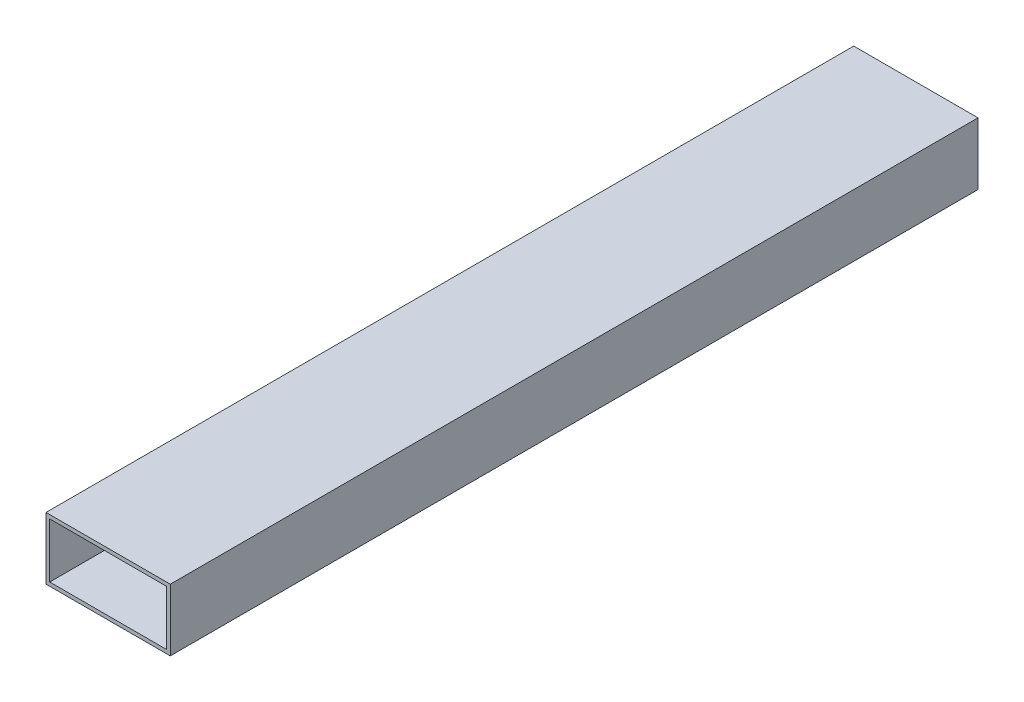
ISO-10303-21;
HEADER;
FILE_DESCRIPTION(('STEP AP214'),'2;1');
FILE_NAME('part.step','',(''),(''),'','','');
FILE_SCHEMA(('AUTOMOTIVE_DESIGN { 1 0 10303 214 1 1 1 1 }'));
ENDSEC;
DATA;
#1=APPLICATION_CONTEXT('core data for automotive mechanical design processes');
#2=APPLICATION_PROTOCOL_DEFINITION('international standard','automotive_design',2000,#1);
#3=PRODUCT_CONTEXT('',#1,'mechanical');
#4=PRODUCT('Part','Part','',(#3));
#5=PRODUCT_RELATED_PRODUCT_CATEGORY('part','',(#4));
#6=PRODUCT_DEFINITION_FORMATION('','',#4);
#7=PRODUCT_DEFINITION_CONTEXT('part definition',#1,'design');
#8=PRODUCT_DEFINITION('design','',#6,#7);
#9=PRODUCT_DEFINITION_SHAPE('','',#8);
#10=(LENGTH_UNIT() NAMED_UNIT(*) SI_UNIT(.MILLI.,.METRE.));
#11=(NAMED_UNIT(*) PLANE_ANGLE_UNIT() SI_UNIT($,.RADIAN.));
#12=(NAMED_UNIT(*) SI_UNIT($,.STERADIAN.) SOLID_ANGLE_UNIT());
#13=UNCERTAINTY_MEASURE_WITH_UNIT(LENGTH_MEASURE(1.E-05),#10,'distance_accuracy_value','');
#14=(GEOMETRIC_REPRESENTATION_CONTEXT(3) GLOBAL_UNCERTAINTY_ASSIGNED_CONTEXT((#13)) GLOBAL_UNIT_ASSIGNED_CONTEXT((#10,
#11,#12)) REPRESENTATION_CONTEXT('',''));
#15=CARTESIAN_POINT('',(0.,0.,0.));
#16=DIRECTION('',(0.,0.,1.));
#17=DIRECTION('',(1.,0.,0.));
#18=AXIS2_PLACEMENT_3D('',#15,#16,#17);
#19=CARTESIAN_POINT('',(0.,0.,330.2));
#20=DIRECTION('',(0.,0.,1.));
#21=DIRECTION('',(1.,0.,0.));
#22=AXIS2_PLACEMENT_3D('',#19,#20,#21);
#23=PLANE('',#22);
#24=DIRECTION('',(0.,1.,0.));
#25=VECTOR('',#24,1.);
#26=CARTESIAN_POINT('',(0.,0.,330.2));
#27=LINE('',#26,#25);
#28=CARTESIAN_POINT('',(0.,0.,330.2));
#29=VERTEX_POINT('',#28);
#30=CARTESIAN_POINT('',(0.,25.4,330.2));
#31=VERTEX_POINT('',#30);
#32=EDGE_CURVE('E177',#29,#31,#27,.T.);
#33=ORIENTED_EDGE('',*,*,#32,.T.);
#34=DIRECTION('',(-1.,0.,0.));
#35=VECTOR('',#34,1.);
#36=CARTESIAN_POINT('',(0.,25.4,330.2));
#37=LINE('',#36,#35);
#38=CARTESIAN_POINT('',(-50.8,25.4,330.2));
#39=VERTEX_POINT('',#38);
#40=EDGE_CURVE('E181',#31,#39,#37,.T.);
#41=ORIENTED_EDGE('',*,*,#40,.T.);
#42=DIRECTION('',(0.,-1.,0.));
#43=VECTOR('',#42,1.);
#44=CARTESIAN_POINT('',(-50.8,0.,330.2));
#45=LINE('',#44,#43);
#46=CARTESIAN_POINT('',(-50.8,0.,330.2));
#47=VERTEX_POINT('',#46);
#48=EDGE_CURVE('E185',#39,#47,#45,.T.);
#49=ORIENTED_EDGE('',*,*,#48,.T.);
#50=DIRECTION('',(1.,0.,0.));
#51=VECTOR('',#50,1.);
#52=CARTESIAN_POINT('',(0.,0.,330.2));
#53=LINE('',#52,#51);
#54=EDGE_CURVE('E188',#47,#29,#53,.T.);
#55=ORIENTED_EDGE('',*,*,#54,.T.);
#56=EDGE_LOOP('',(#33,#41,#49,#55));
#57=FACE_BOUND('',#56,.T.);
#58=DIRECTION('',(-1.,0.,0.));
#59=VECTOR('',#58,1.);
#60=CARTESIAN_POINT('',(0.,23.876,330.2));
#61=LINE('',#60,#59);
#62=CARTESIAN_POINT('',(-1.524,23.876,330.2));
#63=VERTEX_POINT('',#62);
#64=CARTESIAN_POINT('',(-49.276,23.876,330.2));
#65=VERTEX_POINT('',#64);
#66=EDGE_CURVE('E138',#63,#65,#61,.T.);
#67=ORIENTED_EDGE('',*,*,#66,.F.);
#68=DIRECTION('',(0.,1.,0.));
#69=VECTOR('',#68,1.);
#70=CARTESIAN_POINT('',(-1.524,0.,330.2));
#71=LINE('',#70,#69);
#72=CARTESIAN_POINT('',(-1.524,1.524,330.2));
#73=VERTEX_POINT('',#72);
#74=EDGE_CURVE('E129',#73,#63,#71,.T.);
#75=ORIENTED_EDGE('',*,*,#74,.F.);
#76=DIRECTION('',(1.,0.,0.));
#77=VECTOR('',#76,1.);
#78=CARTESIAN_POINT('',(0.,1.524,330.2));
#79=LINE('',#78,#77);
#80=CARTESIAN_POINT('',(-49.276,1.524,330.2));
#81=VERTEX_POINT('',#80);
#82=EDGE_CURVE('E155',#81,#73,#79,.T.);
#83=ORIENTED_EDGE('',*,*,#82,.F.);
#84=DIRECTION('',(0.,-1.,0.));
#85=VECTOR('',#84,1.);
#86=CARTESIAN_POINT('',(-49.276,0.,330.2));
#87=LINE('',#86,#85);
#88=EDGE_CURVE('E151',#65,#81,#87,.T.);
#89=ORIENTED_EDGE('',*,*,#88,.F.);
#90=EDGE_LOOP('',(#67,#75,#83,#89));
#91=FACE_BOUND('',#90,.T.);
#92=ADVANCED_FACE('F63',(#57,#91),#23,.T.);
#93=CARTESIAN_POINT('',(0.,0.,0.));
#94=DIRECTION('',(0.,0.,1.));
#95=DIRECTION('',(1.,0.,0.));
#96=AXIS2_PLACEMENT_3D('',#93,#94,#95);
#97=PLANE('',#96);
#98=DIRECTION('',(0.,1.,0.));
#99=VECTOR('',#98,1.);
#100=CARTESIAN_POINT('',(0.,0.,0.));
#101=LINE('',#100,#99);
#102=CARTESIAN_POINT('',(0.,0.,0.));
#103=VERTEX_POINT('',#102);
#104=CARTESIAN_POINT('',(0.,25.4,0.));
#105=VERTEX_POINT('',#104);
#106=EDGE_CURVE('E147',#103,#105,#101,.T.);
#107=ORIENTED_EDGE('',*,*,#106,.F.);
#108=DIRECTION('',(1.,0.,0.));
#109=VECTOR('',#108,1.);
#110=CARTESIAN_POINT('',(0.,0.,0.));
#111=LINE('',#110,#109);
#112=CARTESIAN_POINT('',(-50.8,0.,0.));
#113=VERTEX_POINT('',#112);
#114=EDGE_CURVE('E182',#113,#103,#111,.T.);
#115=ORIENTED_EDGE('',*,*,#114,.F.);
#116=DIRECTION('',(0.,-1.,0.));
#117=VECTOR('',#116,1.);
#118=CARTESIAN_POINT('',(-50.8,0.,0.));
#119=LINE('',#118,#117);
#120=CARTESIAN_POINT('',(-50.8,25.4,0.));
#121=VERTEX_POINT('',#120);
#122=EDGE_CURVE('E198',#121,#113,#119,.T.);
#123=ORIENTED_EDGE('',*,*,#122,.F.);
#124=DIRECTION('',(-1.,0.,0.));
#125=VECTOR('',#124,1.);
#126=CARTESIAN_POINT('',(0.,25.4,0.));
#127=LINE('',#126,#125);
#128=EDGE_CURVE('E195',#105,#121,#127,.T.);
#129=ORIENTED_EDGE('',*,*,#128,.F.);
#130=EDGE_LOOP('',(#107,#115,#123,#129));
#131=FACE_BOUND('',#130,.T.);
#132=DIRECTION('',(0.,1.,0.));
#133=VECTOR('',#132,1.);
#134=CARTESIAN_POINT('',(-1.524,0.,0.));
#135=LINE('',#134,#133);
#136=CARTESIAN_POINT('',(-1.524,1.524,0.));
#137=VERTEX_POINT('',#136);
#138=CARTESIAN_POINT('',(-1.524,23.876,0.));
#139=VERTEX_POINT('',#138);
#140=EDGE_CURVE('E87',#137,#139,#135,.T.);
#141=ORIENTED_EDGE('',*,*,#140,.T.);
#142=DIRECTION('',(-1.,0.,0.));
#143=VECTOR('',#142,1.);
#144=CARTESIAN_POINT('',(0.,23.876,0.));
#145=LINE('',#144,#143);
#146=CARTESIAN_POINT('',(-49.276,23.876,0.));
#147=VERTEX_POINT('',#146);
#148=EDGE_CURVE('E145',#139,#147,#145,.T.);
#149=ORIENTED_EDGE('',*,*,#148,.T.);
#150=DIRECTION('',(0.,-1.,0.));
#151=VECTOR('',#150,1.);
#152=CARTESIAN_POINT('',(-49.276,0.,0.));
#153=LINE('',#152,#151);
#154=CARTESIAN_POINT('',(-49.276,1.524,0.));
#155=VERTEX_POINT('',#154);
#156=EDGE_CURVE('E164',#147,#155,#153,.T.);
#157=ORIENTED_EDGE('',*,*,#156,.T.);
#158=DIRECTION('',(1.,0.,0.));
#159=VECTOR('',#158,1.);
#160=CARTESIAN_POINT('',(0.,1.524,0.));
#161=LINE('',#160,#159);
#162=EDGE_CURVE('E139',#155,#137,#161,.T.);
#163=ORIENTED_EDGE('',*,*,#162,.T.);
#164=EDGE_LOOP('',(#141,#149,#157,#163));
#165=FACE_BOUND('',#164,.T.);
#166=ADVANCED_FACE('F221',(#131,#165),#97,.F.);
#167=CARTESIAN_POINT('',(0.,0.,330.2));
#168=DIRECTION('',(-1.,0.,0.));
#169=DIRECTION('',(0.,-1.,0.));
#170=AXIS2_PLACEMENT_3D('',#167,#168,#169);
#171=PLANE('',#170);
#172=ORIENTED_EDGE('',*,*,#106,.T.);
#173=DIRECTION('',(0.,0.,-1.));
#174=VECTOR('',#173,1.);
#175=CARTESIAN_POINT('',(0.,25.4,330.2));
#176=LINE('',#175,#174);
#177=EDGE_CURVE('E12',#31,#105,#176,.T.);
#178=ORIENTED_EDGE('',*,*,#177,.F.);
#179=ORIENTED_EDGE('',*,*,#32,.F.);
#180=DIRECTION('',(0.,0.,-1.));
#181=VECTOR('',#180,1.);
#182=CARTESIAN_POINT('',(0.,0.,330.2));
#183=LINE('',#182,#181);
#184=EDGE_CURVE('E191',#29,#103,#183,.T.);
#185=ORIENTED_EDGE('',*,*,#184,.T.);
#186=EDGE_LOOP('',(#172,#178,#179,#185));
#187=FACE_BOUND('',#186,.T.);
#188=ADVANCED_FACE('F65',(#187),#171,.F.);
#189=CARTESIAN_POINT('',(0.,25.4,330.2));
#190=DIRECTION('',(0.,-1.,0.));
#191=DIRECTION('',(1.,0.,0.));
#192=AXIS2_PLACEMENT_3D('',#189,#190,#191);
#193=PLANE('',#192);
#194=ORIENTED_EDGE('',*,*,#128,.T.);
#195=DIRECTION('',(0.,0.,-1.));
#196=VECTOR('',#195,1.);
#197=CARTESIAN_POINT('',(-50.8,25.4,330.2));
#198=LINE('',#197,#196);
#199=EDGE_CURVE('E72',#39,#121,#198,.T.);
#200=ORIENTED_EDGE('',*,*,#199,.F.);
#201=ORIENTED_EDGE('',*,*,#40,.F.);
#202=ORIENTED_EDGE('',*,*,#177,.T.);
#203=EDGE_LOOP('',(#194,#200,#201,#202));
#204=FACE_BOUND('',#203,.T.);
#205=ADVANCED_FACE('F231',(#204),#193,.F.);
#206=CARTESIAN_POINT('',(-50.8,0.,330.2));
#207=DIRECTION('',(1.,0.,0.));
#208=DIRECTION('',(0.,0.,-1.));
#209=AXIS2_PLACEMENT_3D('',#206,#207,#208);
#210=PLANE('',#209);
#211=ORIENTED_EDGE('',*,*,#122,.T.);
#212=DIRECTION('',(0.,0.,-1.));
#213=VECTOR('',#212,1.);
#214=CARTESIAN_POINT('',(-50.8,0.,330.2));
#215=LINE('',#214,#213);
#216=EDGE_CURVE('E206',#47,#113,#215,.T.);
#217=ORIENTED_EDGE('',*,*,#216,.F.);
#218=ORIENTED_EDGE('',*,*,#48,.F.);
#219=ORIENTED_EDGE('',*,*,#199,.T.);
#220=EDGE_LOOP('',(#211,#217,#218,#219));
#221=FACE_BOUND('',#220,.T.);
#222=ADVANCED_FACE('F215',(#221),#210,.F.);
#223=CARTESIAN_POINT('',(0.,0.,330.2));
#224=DIRECTION('',(0.,1.,0.));
#225=DIRECTION('',(0.,0.,1.));
#226=AXIS2_PLACEMENT_3D('',#223,#224,#225);
#227=PLANE('',#226);
#228=ORIENTED_EDGE('',*,*,#114,.T.);
#229=ORIENTED_EDGE('',*,*,#184,.F.);
#230=ORIENTED_EDGE('',*,*,#54,.F.);
#231=ORIENTED_EDGE('',*,*,#216,.T.);
#232=EDGE_LOOP('',(#228,#229,#230,#231));
#233=FACE_BOUND('',#232,.T.);
#234=ADVANCED_FACE('F225',(#233),#227,.F.);
#235=CARTESIAN_POINT('',(-1.524,0.,330.2));
#236=DIRECTION('',(-1.,0.,0.));
#237=DIRECTION('',(0.,-1.,0.));
#238=AXIS2_PLACEMENT_3D('',#235,#236,#237);
#239=PLANE('',#238);
#240=ORIENTED_EDGE('',*,*,#140,.F.);
#241=DIRECTION('',(0.,0.,-1.));
#242=VECTOR('',#241,1.);
#243=CARTESIAN_POINT('',(-1.524,1.524,330.2));
#244=LINE('',#243,#242);
#245=EDGE_CURVE('E133',#73,#137,#244,.T.);
#246=ORIENTED_EDGE('',*,*,#245,.F.);
#247=ORIENTED_EDGE('',*,*,#74,.T.);
#248=DIRECTION('',(0.,0.,-1.));
#249=VECTOR('',#248,1.);
#250=CARTESIAN_POINT('',(-1.524,23.876,330.2));
#251=LINE('',#250,#249);
#252=EDGE_CURVE('E132',#63,#139,#251,.T.);
#253=ORIENTED_EDGE('',*,*,#252,.T.);
#254=EDGE_LOOP('',(#240,#246,#247,#253));
#255=FACE_BOUND('',#254,.T.);
#256=ADVANCED_FACE('F131',(#255),#239,.T.);
#257=CARTESIAN_POINT('',(0.,23.876,330.2));
#258=DIRECTION('',(0.,-1.,0.));
#259=DIRECTION('',(1.,0.,0.));
#260=AXIS2_PLACEMENT_3D('',#257,#258,#259);
#261=PLANE('',#260);
#262=ORIENTED_EDGE('',*,*,#148,.F.);
#263=ORIENTED_EDGE('',*,*,#252,.F.);
#264=ORIENTED_EDGE('',*,*,#66,.T.);
#265=DIRECTION('',(0.,0.,-1.));
#266=VECTOR('',#265,1.);
#267=CARTESIAN_POINT('',(-49.276,23.876,330.2));
#268=LINE('',#267,#266);
#269=EDGE_CURVE('E148',#65,#147,#268,.T.);
#270=ORIENTED_EDGE('',*,*,#269,.T.);
#271=EDGE_LOOP('',(#262,#263,#264,#270));
#272=FACE_BOUND('',#271,.T.);
#273=ADVANCED_FACE('F142',(#272),#261,.T.);
#274=CARTESIAN_POINT('',(-49.276,0.,330.2));
#275=DIRECTION('',(1.,0.,0.));
#276=DIRECTION('',(0.,0.,-1.));
#277=AXIS2_PLACEMENT_3D('',#274,#275,#276);
#278=PLANE('',#277);
#279=ORIENTED_EDGE('',*,*,#156,.F.);
#280=ORIENTED_EDGE('',*,*,#269,.F.);
#281=ORIENTED_EDGE('',*,*,#88,.T.);
#282=DIRECTION('',(0.,0.,-1.));
#283=VECTOR('',#282,1.);
#284=CARTESIAN_POINT('',(-49.276,1.524,330.2));
#285=LINE('',#284,#283);
#286=EDGE_CURVE('E79',#81,#155,#285,.T.);
#287=ORIENTED_EDGE('',*,*,#286,.T.);
#288=EDGE_LOOP('',(#279,#280,#281,#287));
#289=FACE_BOUND('',#288,.T.);
#290=ADVANCED_FACE('F254',(#289),#278,.T.);
#291=CARTESIAN_POINT('',(0.,1.524,330.2));
#292=DIRECTION('',(0.,1.,0.));
#293=DIRECTION('',(0.,0.,1.));
#294=AXIS2_PLACEMENT_3D('',#291,#292,#293);
#295=PLANE('',#294);
#296=ORIENTED_EDGE('',*,*,#162,.F.);
#297=ORIENTED_EDGE('',*,*,#286,.F.);
#298=ORIENTED_EDGE('',*,*,#82,.T.);
#299=ORIENTED_EDGE('',*,*,#245,.T.);
#300=EDGE_LOOP('',(#296,#297,#298,#299));
#301=FACE_BOUND('',#300,.T.);
#302=ADVANCED_FACE('F258',(#301),#295,.T.);
#303=CLOSED_SHELL('',(#92,#166,#188,#205,#222,#234,#256,#273,#290,#302));
#304=MANIFOLD_SOLID_BREP('B2',#303);
#305=ADVANCED_BREP_SHAPE_REPRESENTATION('',(#18,#304),#14);
#306=SHAPE_DEFINITION_REPRESENTATION(#9,#305);
ENDSEC;
END-ISO-10303-21;
